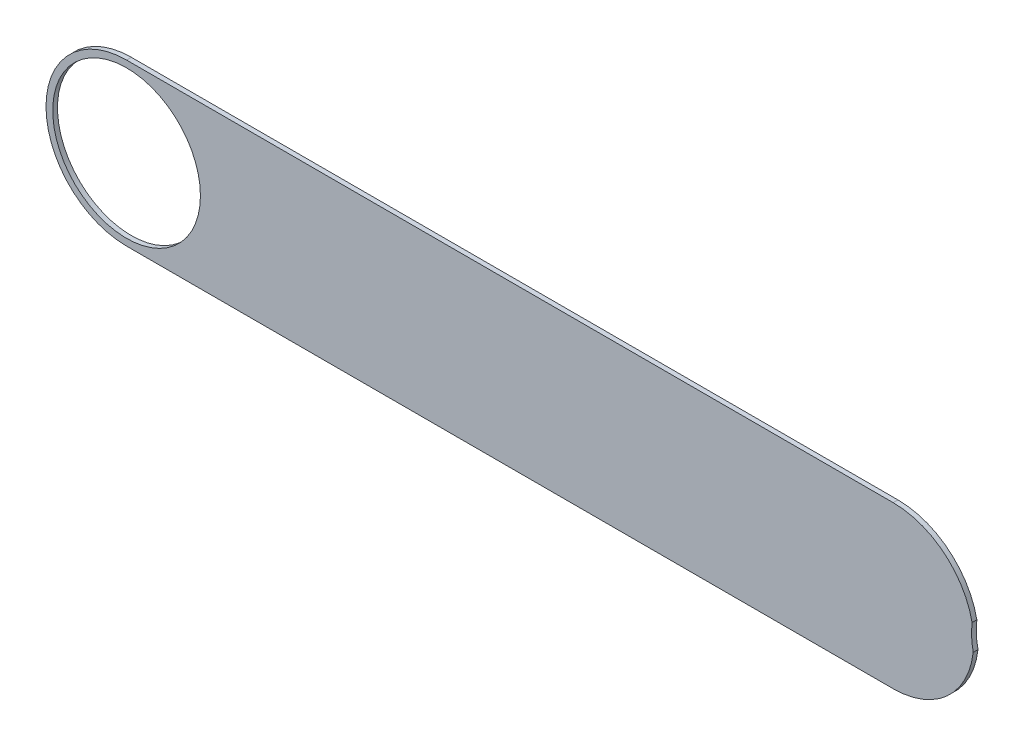
ISO-10303-21;
HEADER;
FILE_DESCRIPTION(('STEP AP214'),'2;1');
FILE_NAME('part.step','',(''),(''),'','','');
FILE_SCHEMA(('AUTOMOTIVE_DESIGN { 1 0 10303 214 1 1 1 1 }'));
ENDSEC;
DATA;
#1=APPLICATION_CONTEXT('core data for automotive mechanical design processes');
#2=APPLICATION_PROTOCOL_DEFINITION('international standard','automotive_design',2000,#1);
#3=PRODUCT_CONTEXT('',#1,'mechanical');
#4=PRODUCT('Part','Part','',(#3));
#5=PRODUCT_RELATED_PRODUCT_CATEGORY('part','',(#4));
#6=PRODUCT_DEFINITION_FORMATION('','',#4);
#7=PRODUCT_DEFINITION_CONTEXT('part definition',#1,'design');
#8=PRODUCT_DEFINITION('design','',#6,#7);
#9=PRODUCT_DEFINITION_SHAPE('','',#8);
#10=(LENGTH_UNIT() NAMED_UNIT(*) SI_UNIT(.MILLI.,.METRE.));
#11=(NAMED_UNIT(*) PLANE_ANGLE_UNIT() SI_UNIT($,.RADIAN.));
#12=(NAMED_UNIT(*) SI_UNIT($,.STERADIAN.) SOLID_ANGLE_UNIT());
#13=UNCERTAINTY_MEASURE_WITH_UNIT(LENGTH_MEASURE(1.E-05),#10,'distance_accuracy_value','');
#14=(GEOMETRIC_REPRESENTATION_CONTEXT(3) GLOBAL_UNCERTAINTY_ASSIGNED_CONTEXT((#13)) GLOBAL_UNIT_ASSIGNED_CONTEXT((#10,
#11,#12)) REPRESENTATION_CONTEXT('',''));
#15=CARTESIAN_POINT('',(0.,0.,0.));
#16=DIRECTION('',(0.,0.,1.));
#17=DIRECTION('',(1.,0.,0.));
#18=AXIS2_PLACEMENT_3D('',#15,#16,#17);
#19=CARTESIAN_POINT('',(96.70415,56.636666,0.));
#20=DIRECTION('',(0.,1.,0.));
#21=DIRECTION('',(1.,0.,0.));
#22=AXIS2_PLACEMENT_3D('',#19,#20,#21);
#23=PLANE('',#22);
#24=DIRECTION('',(1.,0.,0.));
#25=VECTOR('',#24,1.);
#26=CARTESIAN_POINT('',(96.70415,56.636666,0.03556));
#27=LINE('',#26,#25);
#28=CARTESIAN_POINT('',(96.70415,56.636666,0.03556));
#29=VERTEX_POINT('',#28);
#30=CARTESIAN_POINT('',(102.4128,56.636666,0.03556));
#31=VERTEX_POINT('',#30);
#32=EDGE_CURVE('E11',#29,#31,#27,.T.);
#33=ORIENTED_EDGE('',*,*,#32,.F.);
#34=DIRECTION('',(0.,0.,1.));
#35=VECTOR('',#34,1.);
#36=CARTESIAN_POINT('',(96.70415,56.636666,0.));
#37=LINE('',#36,#35);
#38=CARTESIAN_POINT('',(96.70415,56.636666,0.));
#39=VERTEX_POINT('',#38);
#40=EDGE_CURVE('E24',#39,#29,#37,.T.);
#41=ORIENTED_EDGE('',*,*,#40,.F.);
#42=DIRECTION('',(1.,0.,0.));
#43=VECTOR('',#42,1.);
#44=CARTESIAN_POINT('',(96.70415,56.636666,0.));
#45=LINE('',#44,#43);
#46=CARTESIAN_POINT('',(102.4128,56.636666,0.));
#47=VERTEX_POINT('',#46);
#48=EDGE_CURVE('E122',#39,#47,#45,.T.);
#49=ORIENTED_EDGE('',*,*,#48,.T.);
#50=DIRECTION('',(0.,0.,1.));
#51=VECTOR('',#50,1.);
#52=CARTESIAN_POINT('',(102.4128,56.636666,0.));
#53=LINE('',#52,#51);
#54=EDGE_CURVE('E37',#47,#31,#53,.T.);
#55=ORIENTED_EDGE('',*,*,#54,.T.);
#56=EDGE_LOOP('',(#33,#41,#49,#55));
#57=FACE_BOUND('',#56,.T.);
#58=ADVANCED_FACE('F17',(#57),#23,.F.);
#59=CARTESIAN_POINT('',(102.4128,57.2366648,0.));
#60=DIRECTION('',(0.,0.,-1.));
#61=DIRECTION('',(0.,-1.,0.));
#62=AXIS2_PLACEMENT_3D('',#59,#60,#61);
#63=CYLINDRICAL_SURFACE('',#62,0.599998799999995);
#64=CARTESIAN_POINT('',(102.4128,57.2366648,0.03556));
#65=DIRECTION('',(0.,0.,1.));
#66=DIRECTION('',(0.,-1.,0.));
#67=AXIS2_PLACEMENT_3D('',#64,#65,#66);
#68=CIRCLE('',#67,0.599998799999995);
#69=CARTESIAN_POINT('',(103.009000887385,57.1692625605514,0.03556));
#70=VERTEX_POINT('',#69);
#71=EDGE_CURVE('E118',#31,#70,#68,.T.);
#72=ORIENTED_EDGE('',*,*,#71,.F.);
#73=ORIENTED_EDGE('',*,*,#54,.F.);
#74=CARTESIAN_POINT('',(102.4128,57.2366648,0.));
#75=DIRECTION('',(0.,0.,1.));
#76=DIRECTION('',(0.,-1.,0.));
#77=AXIS2_PLACEMENT_3D('',#74,#75,#76);
#78=CIRCLE('',#77,0.599998799999995);
#79=CARTESIAN_POINT('',(103.009000887385,57.1692625605514,0.));
#80=VERTEX_POINT('',#79);
#81=EDGE_CURVE('E115',#47,#80,#78,.T.);
#82=ORIENTED_EDGE('',*,*,#81,.T.);
#83=DIRECTION('',(0.,0.,1.));
#84=VECTOR('',#83,1.);
#85=CARTESIAN_POINT('',(103.009000887385,57.1692625605514,0.));
#86=LINE('',#85,#84);
#87=EDGE_CURVE('E113',#80,#70,#86,.T.);
#88=ORIENTED_EDGE('',*,*,#87,.T.);
#89=EDGE_LOOP('',(#72,#73,#82,#88));
#90=FACE_BOUND('',#89,.T.);
#91=ADVANCED_FACE('F131',(#90),#63,.T.);
#92=CARTESIAN_POINT('',(103.546148,57.2874648,0.));
#93=DIRECTION('',(0.,0.,-1.));
#94=DIRECTION('',(1.,0.,0.));
#95=AXIS2_PLACEMENT_3D('',#92,#93,#94);
#96=CYLINDRICAL_SURFACE('',#95,0.5499989);
#97=DIRECTION('',(0.,0.,1.));
#98=VECTOR('',#97,1.);
#99=CARTESIAN_POINT('',(103.000579821216,57.3571365467817,0.));
#100=LINE('',#99,#98);
#101=CARTESIAN_POINT('',(103.000579821216,57.3571365467817,0.));
#102=VERTEX_POINT('',#101);
#103=CARTESIAN_POINT('',(103.000579821216,57.3571365467817,0.03556));
#104=VERTEX_POINT('',#103);
#105=EDGE_CURVE('E111',#102,#104,#100,.T.);
#106=ORIENTED_EDGE('',*,*,#105,.T.);
#107=CARTESIAN_POINT('',(103.546148,57.2874648,0.03556));
#108=DIRECTION('',(0.,0.,1.));
#109=DIRECTION('',(1.,0.,0.));
#110=AXIS2_PLACEMENT_3D('',#107,#108,#109);
#111=CIRCLE('',#110,0.5499989);
#112=EDGE_CURVE('E108',#104,#70,#111,.T.);
#113=ORIENTED_EDGE('',*,*,#112,.T.);
#114=ORIENTED_EDGE('',*,*,#87,.F.);
#115=CARTESIAN_POINT('',(103.546148,57.2874648,0.));
#116=DIRECTION('',(0.,0.,1.));
#117=DIRECTION('',(1.,0.,0.));
#118=AXIS2_PLACEMENT_3D('',#115,#116,#117);
#119=CIRCLE('',#118,0.5499989);
#120=EDGE_CURVE('E105',#102,#80,#119,.T.);
#121=ORIENTED_EDGE('',*,*,#120,.F.);
#122=EDGE_LOOP('',(#106,#113,#114,#121));
#123=FACE_BOUND('',#122,.T.);
#124=ADVANCED_FACE('F138',(#123),#96,.F.);
#125=CARTESIAN_POINT('',(102.4128,57.2366648,0.));
#126=DIRECTION('',(0.,0.,-1.));
#127=DIRECTION('',(0.,-1.,0.));
#128=AXIS2_PLACEMENT_3D('',#125,#126,#127);
#129=CYLINDRICAL_SURFACE('',#128,0.599998799999995);
#130=CARTESIAN_POINT('',(102.4128,57.2366648,0.03556));
#131=DIRECTION('',(0.,0.,1.));
#132=DIRECTION('',(0.,-1.,0.));
#133=AXIS2_PLACEMENT_3D('',#130,#131,#132);
#134=CIRCLE('',#133,0.599998799999995);
#135=CARTESIAN_POINT('',(102.4128,57.8366636,0.03556));
#136=VERTEX_POINT('',#135);
#137=EDGE_CURVE('E102',#104,#136,#134,.T.);
#138=ORIENTED_EDGE('',*,*,#137,.F.);
#139=ORIENTED_EDGE('',*,*,#105,.F.);
#140=CARTESIAN_POINT('',(102.4128,57.8366636,0.));
#141=VERTEX_POINT('',#140);
#142=EDGE_CURVE('E101',#102,#141,#78,.T.);
#143=ORIENTED_EDGE('',*,*,#142,.T.);
#144=DIRECTION('',(0.,0.,1.));
#145=VECTOR('',#144,1.);
#146=CARTESIAN_POINT('',(102.4128,57.8366636,0.));
#147=LINE('',#146,#145);
#148=EDGE_CURVE('E99',#141,#136,#147,.T.);
#149=ORIENTED_EDGE('',*,*,#148,.T.);
#150=EDGE_LOOP('',(#138,#139,#143,#149));
#151=FACE_BOUND('',#150,.T.);
#152=ADVANCED_FACE('F141',(#151),#129,.T.);
#153=CARTESIAN_POINT('',(102.4128,57.8366636,0.));
#154=DIRECTION('',(0.,-1.,0.));
#155=DIRECTION('',(-1.,0.,0.));
#156=AXIS2_PLACEMENT_3D('',#153,#154,#155);
#157=PLANE('',#156);
#158=DIRECTION('',(-1.,0.,0.));
#159=VECTOR('',#158,1.);
#160=CARTESIAN_POINT('',(102.4128,57.8366636,0.03556));
#161=LINE('',#160,#159);
#162=CARTESIAN_POINT('',(96.70415,57.8366636,0.03556));
#163=VERTEX_POINT('',#162);
#164=EDGE_CURVE('E96',#136,#163,#161,.T.);
#165=ORIENTED_EDGE('',*,*,#164,.F.);
#166=ORIENTED_EDGE('',*,*,#148,.F.);
#167=DIRECTION('',(-1.,0.,0.));
#168=VECTOR('',#167,1.);
#169=CARTESIAN_POINT('',(102.4128,57.8366636,0.));
#170=LINE('',#169,#168);
#171=CARTESIAN_POINT('',(96.70415,57.8366636,0.));
#172=VERTEX_POINT('',#171);
#173=EDGE_CURVE('E93',#141,#172,#170,.T.);
#174=ORIENTED_EDGE('',*,*,#173,.T.);
#175=DIRECTION('',(0.,0.,1.));
#176=VECTOR('',#175,1.);
#177=CARTESIAN_POINT('',(96.70415,57.8366636,0.));
#178=LINE('',#177,#176);
#179=EDGE_CURVE('E91',#172,#163,#178,.T.);
#180=ORIENTED_EDGE('',*,*,#179,.T.);
#181=EDGE_LOOP('',(#165,#166,#174,#180));
#182=FACE_BOUND('',#181,.T.);
#183=ADVANCED_FACE('F145',(#182),#157,.F.);
#184=CARTESIAN_POINT('',(96.70415,57.2366648,0.));
#185=DIRECTION('',(0.,0.,-1.));
#186=DIRECTION('',(0.,1.,0.));
#187=AXIS2_PLACEMENT_3D('',#184,#185,#186);
#188=CYLINDRICAL_SURFACE('',#187,0.599998799999995);
#189=CARTESIAN_POINT('',(96.70415,57.2366648,0.03556));
#190=DIRECTION('',(0.,0.,1.));
#191=DIRECTION('',(0.,1.,0.));
#192=AXIS2_PLACEMENT_3D('',#189,#190,#191);
#193=CIRCLE('',#192,0.599998799999995);
#194=EDGE_CURVE('E88',#163,#29,#193,.T.);
#195=ORIENTED_EDGE('',*,*,#194,.F.);
#196=ORIENTED_EDGE('',*,*,#179,.F.);
#197=CARTESIAN_POINT('',(96.70415,57.2366648,0.));
#198=DIRECTION('',(0.,0.,1.));
#199=DIRECTION('',(0.,1.,0.));
#200=AXIS2_PLACEMENT_3D('',#197,#198,#199);
#201=CIRCLE('',#200,0.599998799999995);
#202=EDGE_CURVE('E80',#172,#39,#201,.T.);
#203=ORIENTED_EDGE('',*,*,#202,.T.);
#204=ORIENTED_EDGE('',*,*,#40,.T.);
#205=EDGE_LOOP('',(#195,#196,#203,#204));
#206=FACE_BOUND('',#205,.T.);
#207=ADVANCED_FACE('F146',(#206),#188,.T.);
#208=CARTESIAN_POINT('',(96.70415,57.2366648,0.));
#209=DIRECTION('',(0.,0.,-1.));
#210=DIRECTION('',(1.,0.,0.));
#211=AXIS2_PLACEMENT_3D('',#208,#209,#210);
#212=CYLINDRICAL_SURFACE('',#211,0.5499989);
#213=DIRECTION('',(0.,0.,1.));
#214=VECTOR('',#213,1.);
#215=CARTESIAN_POINT('',(97.2541489,57.2366648,0.));
#216=LINE('',#215,#214);
#217=CARTESIAN_POINT('',(97.2541489,57.2366648,0.));
#218=VERTEX_POINT('',#217);
#219=CARTESIAN_POINT('',(97.2541489,57.2366648,0.03556));
#220=VERTEX_POINT('',#219);
#221=EDGE_CURVE('E74',#218,#220,#216,.T.);
#222=ORIENTED_EDGE('',*,*,#221,.T.);
#223=CARTESIAN_POINT('',(96.70415,57.2366648,0.03556));
#224=DIRECTION('',(0.,0.,1.));
#225=DIRECTION('',(1.,0.,0.));
#226=AXIS2_PLACEMENT_3D('',#223,#224,#225);
#227=CIRCLE('',#226,0.5499989);
#228=EDGE_CURVE('E79',#220,#220,#227,.T.);
#229=ORIENTED_EDGE('',*,*,#228,.T.);
#230=ORIENTED_EDGE('',*,*,#221,.F.);
#231=CARTESIAN_POINT('',(96.70415,57.2366648,0.));
#232=DIRECTION('',(0.,0.,1.));
#233=DIRECTION('',(1.,0.,0.));
#234=AXIS2_PLACEMENT_3D('',#231,#232,#233);
#235=CIRCLE('',#234,0.5499989);
#236=EDGE_CURVE('E77',#218,#218,#235,.T.);
#237=ORIENTED_EDGE('',*,*,#236,.F.);
#238=EDGE_LOOP('',(#222,#229,#230,#237));
#239=FACE_BOUND('',#238,.T.);
#240=ADVANCED_FACE('F76',(#239),#212,.F.);
#241=CARTESIAN_POINT('',(96.70415,56.636666,0.));
#242=DIRECTION('',(0.,0.,-1.));
#243=DIRECTION('',(-1.,0.,0.));
#244=AXIS2_PLACEMENT_3D('',#241,#242,#243);
#245=PLANE('',#244);
#246=ORIENTED_EDGE('',*,*,#48,.F.);
#247=ORIENTED_EDGE('',*,*,#202,.F.);
#248=ORIENTED_EDGE('',*,*,#173,.F.);
#249=ORIENTED_EDGE('',*,*,#142,.F.);
#250=ORIENTED_EDGE('',*,*,#120,.T.);
#251=ORIENTED_EDGE('',*,*,#81,.F.);
#252=EDGE_LOOP('',(#246,#247,#248,#249,#250,#251));
#253=FACE_BOUND('',#252,.T.);
#254=ORIENTED_EDGE('',*,*,#236,.T.);
#255=EDGE_LOOP('',(#254));
#256=FACE_BOUND('',#255,.T.);
#257=ADVANCED_FACE('F83',(#253,#256),#245,.T.);
#258=CARTESIAN_POINT('',(96.70415,56.636666,0.03556));
#259=DIRECTION('',(0.,0.,-1.));
#260=DIRECTION('',(-1.,0.,0.));
#261=AXIS2_PLACEMENT_3D('',#258,#259,#260);
#262=PLANE('',#261);
#263=ORIENTED_EDGE('',*,*,#194,.T.);
#264=ORIENTED_EDGE('',*,*,#32,.T.);
#265=ORIENTED_EDGE('',*,*,#71,.T.);
#266=ORIENTED_EDGE('',*,*,#112,.F.);
#267=ORIENTED_EDGE('',*,*,#137,.T.);
#268=ORIENTED_EDGE('',*,*,#164,.T.);
#269=EDGE_LOOP('',(#263,#264,#265,#266,#267,#268));
#270=FACE_BOUND('',#269,.T.);
#271=ORIENTED_EDGE('',*,*,#228,.F.);
#272=EDGE_LOOP('',(#271));
#273=FACE_BOUND('',#272,.T.);
#274=ADVANCED_FACE('F134',(#270,#273),#262,.F.);
#275=CLOSED_SHELL('',(#58,#91,#124,#152,#183,#207,#240,#257,#274));
#276=MANIFOLD_SOLID_BREP('B1',#275);
#277=ADVANCED_BREP_SHAPE_REPRESENTATION('',(#18,#276),#14);
#278=SHAPE_DEFINITION_REPRESENTATION(#9,#277);
ENDSEC;
END-ISO-10303-21;
